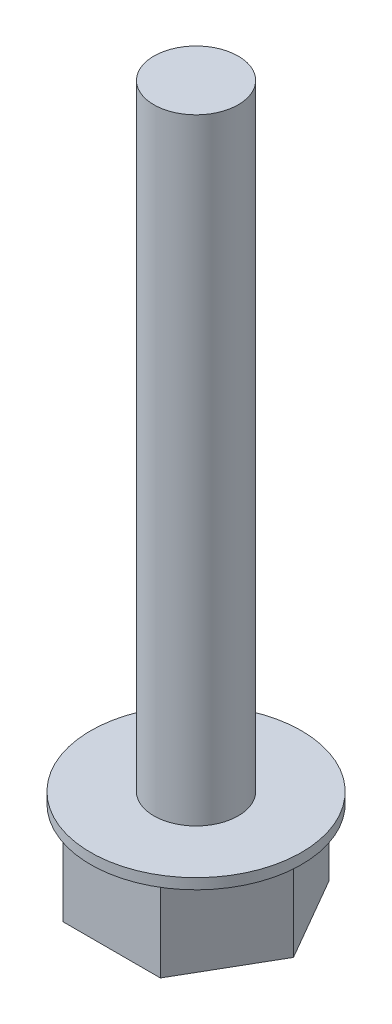
ISO-10303-21;
HEADER;
FILE_DESCRIPTION(('STEP AP214'),'2;1');
FILE_NAME('part.step','',(''),(''),'','','');
FILE_SCHEMA(('AUTOMOTIVE_DESIGN { 1 0 10303 214 1 1 1 1 }'));
ENDSEC;
DATA;
#1=APPLICATION_CONTEXT('core data for automotive mechanical design processes');
#2=APPLICATION_PROTOCOL_DEFINITION('international standard','automotive_design',2000,#1);
#3=PRODUCT_CONTEXT('',#1,'mechanical');
#4=PRODUCT('Part','Part','',(#3));
#5=PRODUCT_RELATED_PRODUCT_CATEGORY('part','',(#4));
#6=PRODUCT_DEFINITION_FORMATION('','',#4);
#7=PRODUCT_DEFINITION_CONTEXT('part definition',#1,'design');
#8=PRODUCT_DEFINITION('design','',#6,#7);
#9=PRODUCT_DEFINITION_SHAPE('','',#8);
#10=(LENGTH_UNIT() NAMED_UNIT(*) SI_UNIT(.MILLI.,.METRE.));
#11=(NAMED_UNIT(*) PLANE_ANGLE_UNIT() SI_UNIT($,.RADIAN.));
#12=(NAMED_UNIT(*) SI_UNIT($,.STERADIAN.) SOLID_ANGLE_UNIT());
#13=UNCERTAINTY_MEASURE_WITH_UNIT(LENGTH_MEASURE(1.E-05),#10,'distance_accuracy_value','');
#14=(GEOMETRIC_REPRESENTATION_CONTEXT(3) GLOBAL_UNCERTAINTY_ASSIGNED_CONTEXT((#13)) GLOBAL_UNIT_ASSIGNED_CONTEXT((#10,
#11,#12)) REPRESENTATION_CONTEXT('',''));
#15=CARTESIAN_POINT('',(0.,0.,0.));
#16=DIRECTION('',(0.,0.,1.));
#17=DIRECTION('',(1.,0.,0.));
#18=AXIS2_PLACEMENT_3D('',#15,#16,#17);
#19=CARTESIAN_POINT('',(0.,46.355,0.));
#20=DIRECTION('',(0.,-1.,0.));
#21=DIRECTION('',(0.,0.,-1.));
#22=AXIS2_PLACEMENT_3D('',#19,#20,#21);
#23=CYLINDRICAL_SURFACE('',#22,3.175);
#24=CARTESIAN_POINT('',(0.,46.355,0.));
#25=DIRECTION('',(0.,1.,0.));
#26=DIRECTION('',(0.,0.,1.));
#27=AXIS2_PLACEMENT_3D('',#24,#25,#26);
#28=CIRCLE('',#27,3.175);
#29=CARTESIAN_POINT('',(0.,46.355,-3.175));
#30=VERTEX_POINT('',#29);
#31=EDGE_CURVE('E11',#30,#30,#28,.T.);
#32=CARTESIAN_POINT('',(0.,0.,0.));
#33=DIRECTION('',(0.,1.,0.));
#34=DIRECTION('',(0.,0.,1.));
#35=AXIS2_PLACEMENT_3D('',#32,#33,#34);
#36=CIRCLE('',#35,3.175);
#37=CARTESIAN_POINT('',(0.,0.,-3.175));
#38=VERTEX_POINT('',#37);
#39=EDGE_CURVE('E36',#38,#38,#36,.T.);
#40=CARTESIAN_POINT('',(0.,46.355,-3.175));
#41=CARTESIAN_POINT('',(0.,45.8721354166667,-3.175));
#42=CARTESIAN_POINT('',(0.,45.3892708333333,-3.175));
#43=CARTESIAN_POINT('',(0.,44.4235416666667,-3.175));
#44=CARTESIAN_POINT('',(0.,43.9406770833333,-3.175));
#45=CARTESIAN_POINT('',(0.,42.9749479166667,-3.175));
#46=CARTESIAN_POINT('',(0.,42.4920833333333,-3.175));
#47=CARTESIAN_POINT('',(0.,41.5263541666667,-3.175));
#48=CARTESIAN_POINT('',(0.,41.0434895833333,-3.175));
#49=CARTESIAN_POINT('',(0.,40.0777604166667,-3.175));
#50=CARTESIAN_POINT('',(0.,39.5948958333333,-3.175));
#51=CARTESIAN_POINT('',(0.,38.6291666666667,-3.175));
#52=CARTESIAN_POINT('',(0.,38.1463020833333,-3.175));
#53=CARTESIAN_POINT('',(0.,37.1805729166667,-3.175));
#54=CARTESIAN_POINT('',(0.,36.6977083333333,-3.175));
#55=CARTESIAN_POINT('',(0.,35.7319791666667,-3.175));
#56=CARTESIAN_POINT('',(0.,35.2491145833333,-3.175));
#57=CARTESIAN_POINT('',(0.,34.2833854166667,-3.175));
#58=CARTESIAN_POINT('',(0.,33.8005208333333,-3.175));
#59=CARTESIAN_POINT('',(0.,32.8347916666667,-3.175));
#60=CARTESIAN_POINT('',(0.,32.3519270833333,-3.175));
#61=CARTESIAN_POINT('',(0.,31.3861979166667,-3.175));
#62=CARTESIAN_POINT('',(0.,30.9033333333333,-3.175));
#63=CARTESIAN_POINT('',(0.,29.9376041666667,-3.175));
#64=CARTESIAN_POINT('',(0.,29.4547395833333,-3.175));
#65=CARTESIAN_POINT('',(0.,28.4890104166667,-3.175));
#66=CARTESIAN_POINT('',(0.,28.0061458333333,-3.175));
#67=CARTESIAN_POINT('',(0.,27.0404166666667,-3.175));
#68=CARTESIAN_POINT('',(0.,26.5575520833333,-3.175));
#69=CARTESIAN_POINT('',(0.,25.5918229166667,-3.175));
#70=CARTESIAN_POINT('',(0.,25.1089583333333,-3.175));
#71=CARTESIAN_POINT('',(0.,24.1432291666667,-3.175));
#72=CARTESIAN_POINT('',(0.,23.6603645833333,-3.175));
#73=CARTESIAN_POINT('',(0.,22.6946354166667,-3.175));
#74=CARTESIAN_POINT('',(0.,22.2117708333333,-3.175));
#75=CARTESIAN_POINT('',(0.,21.2460416666667,-3.175));
#76=CARTESIAN_POINT('',(0.,20.7631770833333,-3.175));
#77=CARTESIAN_POINT('',(0.,19.7974479166667,-3.175));
#78=CARTESIAN_POINT('',(0.,19.3145833333333,-3.175));
#79=CARTESIAN_POINT('',(0.,18.3488541666667,-3.175));
#80=CARTESIAN_POINT('',(0.,17.8659895833333,-3.175));
#81=CARTESIAN_POINT('',(0.,16.9002604166667,-3.175));
#82=CARTESIAN_POINT('',(0.,16.4173958333333,-3.175));
#83=CARTESIAN_POINT('',(0.,15.4516666666667,-3.175));
#84=CARTESIAN_POINT('',(0.,14.9688020833333,-3.175));
#85=CARTESIAN_POINT('',(0.,14.0030729166667,-3.175));
#86=CARTESIAN_POINT('',(0.,13.5202083333333,-3.175));
#87=CARTESIAN_POINT('',(0.,12.5544791666667,-3.175));
#88=CARTESIAN_POINT('',(0.,12.0716145833333,-3.175));
#89=CARTESIAN_POINT('',(0.,11.1058854166667,-3.175));
#90=CARTESIAN_POINT('',(0.,10.6230208333333,-3.175));
#91=CARTESIAN_POINT('',(0.,9.65729166666667,-3.175));
#92=CARTESIAN_POINT('',(0.,9.17442708333333,-3.175));
#93=CARTESIAN_POINT('',(0.,8.20869791666667,-3.175));
#94=CARTESIAN_POINT('',(0.,7.72583333333333,-3.175));
#95=CARTESIAN_POINT('',(0.,6.76010416666667,-3.175));
#96=CARTESIAN_POINT('',(0.,6.27723958333334,-3.175));
#97=CARTESIAN_POINT('',(0.,5.31151041666667,-3.175));
#98=CARTESIAN_POINT('',(0.,4.82864583333333,-3.175));
#99=CARTESIAN_POINT('',(0.,3.86291666666667,-3.175));
#100=CARTESIAN_POINT('',(0.,3.38005208333333,-3.175));
#101=CARTESIAN_POINT('',(0.,2.41432291666667,-3.175));
#102=CARTESIAN_POINT('',(0.,1.93145833333333,-3.175));
#103=CARTESIAN_POINT('',(0.,0.965729166666665,-3.175));
#104=CARTESIAN_POINT('',(0.,0.482864583333333,-3.175));
#105=CARTESIAN_POINT('',(0.,0.,-3.175));
#106=B_SPLINE_CURVE_WITH_KNOTS('',3,(#40,#41,#42,#43,#44,#45,#46,#47,#48,#49,#50,#51,#52,#53,
#54,#55,#56,#57,#58,#59,#60,#61,#62,#63,#64,#65,#66,#67,#68,#69,#70,#71,#72,#73,#74,#75,#76,#77,
#78,#79,#80,#81,#82,#83,#84,#85,#86,#87,#88,#89,#90,#91,#92,#93,#94,#95,#96,#97,#98,#99,#100,
#101,#102,#103,#104,#105),.UNSPECIFIED.,.F.,.F.,(4,2,2,2,2,2,2,2,2,2,2,2,2,2,2,2,2,2,2,2,2,2,2,
2,2,2,2,2,2,2,2,2,4),(0.,1.44859375,2.8971875,4.34578125000001,5.794375,7.24296875,
8.69156250000001,10.14015625,11.58875,13.03734375,14.4859375,15.93453125,17.383125,18.83171875,
20.2803125,21.72890625,23.1775,24.62609375,26.0746875,27.52328125,28.971875,30.42046875,
31.8690625,33.31765625,34.76625,36.21484375,37.6634375,39.11203125,40.560625,42.00921875,
43.4578125,44.90640625,46.355),.UNSPECIFIED.);
#107=EDGE_CURVE('BSEAM33',#30,#38,#106,.T.);
#108=ORIENTED_EDGE('',*,*,#31,.F.);
#109=ORIENTED_EDGE('',*,*,#39,.T.);
#110=ORIENTED_EDGE('',*,*,#107,.T.);
#111=ORIENTED_EDGE('',*,*,#107,.F.);
#112=EDGE_LOOP('',(#108,#110,#109,#111));
#113=FACE_BOUND('',#112,.T.);
#114=ADVANCED_FACE('F33',(#113),#23,.T.);
#115=CARTESIAN_POINT('',(0.,46.355,0.));
#116=DIRECTION('',(0.,1.,0.));
#117=DIRECTION('',(0.,0.,1.));
#118=AXIS2_PLACEMENT_3D('',#115,#116,#117);
#119=PLANE('',#118);
#120=ORIENTED_EDGE('',*,*,#31,.T.);
#121=EDGE_LOOP('',(#120));
#122=FACE_BOUND('',#121,.T.);
#123=ADVANCED_FACE('F168',(#122),#119,.T.);
#124=CARTESIAN_POINT('',(0.,-0.79375,0.));
#125=DIRECTION('',(0.,1.,0.));
#126=DIRECTION('',(0.,0.,1.));
#127=AXIS2_PLACEMENT_3D('',#124,#125,#126);
#128=CYLINDRICAL_SURFACE('',#127,7.9375);
#129=CARTESIAN_POINT('',(0.,-0.79375,0.));
#130=DIRECTION('',(0.,-1.,0.));
#131=DIRECTION('',(0.,0.,-1.));
#132=AXIS2_PLACEMENT_3D('',#129,#130,#131);
#133=CIRCLE('',#132,7.9375);
#134=CARTESIAN_POINT('',(0.,-0.79375,-7.9375));
#135=VERTEX_POINT('',#134);
#136=EDGE_CURVE('E143',#135,#135,#133,.T.);
#137=ORIENTED_EDGE('',*,*,#136,.F.);
#138=EDGE_LOOP('',(#137));
#139=FACE_BOUND('',#138,.T.);
#140=CARTESIAN_POINT('',(0.,0.,0.));
#141=DIRECTION('',(0.,-1.,0.));
#142=DIRECTION('',(0.,0.,-1.));
#143=AXIS2_PLACEMENT_3D('',#140,#141,#142);
#144=CIRCLE('',#143,7.9375);
#145=CARTESIAN_POINT('',(0.,0.,-7.9375));
#146=VERTEX_POINT('',#145);
#147=EDGE_CURVE('E142',#146,#146,#144,.T.);
#148=ORIENTED_EDGE('',*,*,#147,.T.);
#149=EDGE_LOOP('',(#148));
#150=FACE_BOUND('',#149,.T.);
#151=ADVANCED_FACE('F149',(#139,#150),#128,.T.);
#152=CARTESIAN_POINT('',(0.,-0.79375,0.));
#153=DIRECTION('',(0.,-1.,0.));
#154=DIRECTION('',(0.,0.,-1.));
#155=AXIS2_PLACEMENT_3D('',#152,#153,#154);
#156=PLANE('',#155);
#157=DIRECTION('',(-0.5,0.,0.866025403784438));
#158=VECTOR('',#157,1.);
#159=CARTESIAN_POINT('',(7.33234841870825,-0.79375,0.));
#160=LINE('',#159,#158);
#161=CARTESIAN_POINT('',(7.33234841870825,-0.79375,0.));
#162=VERTEX_POINT('',#161);
#163=CARTESIAN_POINT('',(3.66617420935412,-0.79375,6.35));
#164=VERTEX_POINT('',#163);
#165=EDGE_CURVE('E47',#162,#164,#160,.T.);
#166=ORIENTED_EDGE('',*,*,#165,.F.);
#167=DIRECTION('',(0.5,0.,0.866025403784439));
#168=VECTOR('',#167,1.);
#169=CARTESIAN_POINT('',(3.66617420935413,-0.79375,-6.35));
#170=LINE('',#169,#168);
#171=CARTESIAN_POINT('',(3.66617420935413,-0.79375,-6.35));
#172=VERTEX_POINT('',#171);
#173=EDGE_CURVE('E51',#172,#162,#170,.T.);
#174=ORIENTED_EDGE('',*,*,#173,.F.);
#175=DIRECTION('',(1.,0.,0.));
#176=VECTOR('',#175,1.);
#177=CARTESIAN_POINT('',(-3.66617420935412,-0.79375,-6.35));
#178=LINE('',#177,#176);
#179=CARTESIAN_POINT('',(-3.66617420935412,-0.79375,-6.35));
#180=VERTEX_POINT('',#179);
#181=EDGE_CURVE('E122',#180,#172,#178,.T.);
#182=ORIENTED_EDGE('',*,*,#181,.F.);
#183=DIRECTION('',(0.5,0.,-0.866025403784439));
#184=VECTOR('',#183,1.);
#185=CARTESIAN_POINT('',(-7.33234841870825,-0.79375,0.));
#186=LINE('',#185,#184);
#187=CARTESIAN_POINT('',(-7.33234841870825,-0.79375,0.));
#188=VERTEX_POINT('',#187);
#189=EDGE_CURVE('E119',#188,#180,#186,.T.);
#190=ORIENTED_EDGE('',*,*,#189,.F.);
#191=DIRECTION('',(-0.5,0.,-0.866025403784438));
#192=VECTOR('',#191,1.);
#193=CARTESIAN_POINT('',(-3.66617420935412,-0.79375,6.35));
#194=LINE('',#193,#192);
#195=CARTESIAN_POINT('',(-3.66617420935412,-0.79375,6.35));
#196=VERTEX_POINT('',#195);
#197=EDGE_CURVE('E116',#196,#188,#194,.T.);
#198=ORIENTED_EDGE('',*,*,#197,.F.);
#199=DIRECTION('',(-1.,0.,0.));
#200=VECTOR('',#199,1.);
#201=CARTESIAN_POINT('',(3.66617420935412,-0.79375,6.35));
#202=LINE('',#201,#200);
#203=EDGE_CURVE('E113',#164,#196,#202,.T.);
#204=ORIENTED_EDGE('',*,*,#203,.F.);
#205=EDGE_LOOP('',(#166,#174,#182,#190,#198,#204));
#206=FACE_BOUND('',#205,.T.);
#207=ORIENTED_EDGE('',*,*,#136,.T.);
#208=EDGE_LOOP('',(#207));
#209=FACE_BOUND('',#208,.T.);
#210=ADVANCED_FACE('F154',(#206,#209),#156,.T.);
#211=CARTESIAN_POINT('',(0.,0.,0.));
#212=DIRECTION('',(0.,-1.,0.));
#213=DIRECTION('',(0.,0.,-1.));
#214=AXIS2_PLACEMENT_3D('',#211,#212,#213);
#215=PLANE('',#214);
#216=ORIENTED_EDGE('',*,*,#39,.F.);
#217=EDGE_LOOP('',(#216));
#218=FACE_BOUND('',#217,.T.);
#219=ORIENTED_EDGE('',*,*,#147,.F.);
#220=EDGE_LOOP('',(#219));
#221=FACE_BOUND('',#220,.T.);
#222=ADVANCED_FACE('F151',(#218,#221),#215,.F.);
#223=CARTESIAN_POINT('',(7.33234841870825,-7.14375,0.));
#224=DIRECTION('',(-0.866025403784438,0.,-0.5));
#225=DIRECTION('',(-0.5,0.,0.866025403784438));
#226=AXIS2_PLACEMENT_3D('',#223,#224,#225);
#227=PLANE('',#226);
#228=ORIENTED_EDGE('',*,*,#165,.T.);
#229=DIRECTION('',(0.,1.,0.));
#230=VECTOR('',#229,1.);
#231=CARTESIAN_POINT('',(3.66617420935412,-7.14375,6.35));
#232=LINE('',#231,#230);
#233=CARTESIAN_POINT('',(3.66617420935412,-7.14375,6.35));
#234=VERTEX_POINT('',#233);
#235=EDGE_CURVE('E139',#234,#164,#232,.T.);
#236=ORIENTED_EDGE('',*,*,#235,.F.);
#237=DIRECTION('',(-0.5,0.,0.866025403784438));
#238=VECTOR('',#237,1.);
#239=CARTESIAN_POINT('',(7.33234841870825,-7.14375,0.));
#240=LINE('',#239,#238);
#241=CARTESIAN_POINT('',(7.33234841870825,-7.14375,0.));
#242=VERTEX_POINT('',#241);
#243=EDGE_CURVE('E98',#242,#234,#240,.T.);
#244=ORIENTED_EDGE('',*,*,#243,.F.);
#245=DIRECTION('',(0.,1.,0.));
#246=VECTOR('',#245,1.);
#247=CARTESIAN_POINT('',(7.33234841870825,-7.14375,0.));
#248=LINE('',#247,#246);
#249=EDGE_CURVE('E111',#242,#162,#248,.T.);
#250=ORIENTED_EDGE('',*,*,#249,.T.);
#251=EDGE_LOOP('',(#228,#236,#244,#250));
#252=FACE_BOUND('',#251,.T.);
#253=ADVANCED_FACE('F153',(#252),#227,.F.);
#254=CARTESIAN_POINT('',(3.66617420935412,-7.14375,6.35));
#255=DIRECTION('',(0.,0.,-1.));
#256=DIRECTION('',(-1.,0.,0.));
#257=AXIS2_PLACEMENT_3D('',#254,#255,#256);
#258=PLANE('',#257);
#259=ORIENTED_EDGE('',*,*,#203,.T.);
#260=DIRECTION('',(0.,1.,0.));
#261=VECTOR('',#260,1.);
#262=CARTESIAN_POINT('',(-3.66617420935412,-7.14375,6.35));
#263=LINE('',#262,#261);
#264=CARTESIAN_POINT('',(-3.66617420935412,-7.14375,6.35));
#265=VERTEX_POINT('',#264);
#266=EDGE_CURVE('E136',#265,#196,#263,.T.);
#267=ORIENTED_EDGE('',*,*,#266,.F.);
#268=DIRECTION('',(-1.,0.,0.));
#269=VECTOR('',#268,1.);
#270=CARTESIAN_POINT('',(3.66617420935412,-7.14375,6.35));
#271=LINE('',#270,#269);
#272=EDGE_CURVE('E101',#234,#265,#271,.T.);
#273=ORIENTED_EDGE('',*,*,#272,.F.);
#274=ORIENTED_EDGE('',*,*,#235,.T.);
#275=EDGE_LOOP('',(#259,#267,#273,#274));
#276=FACE_BOUND('',#275,.T.);
#277=ADVANCED_FACE('F161',(#276),#258,.F.);
#278=CARTESIAN_POINT('',(-3.66617420935412,-7.14375,6.35));
#279=DIRECTION('',(0.866025403784439,0.,-0.5));
#280=DIRECTION('',(-0.5,0.,-0.866025403784439));
#281=AXIS2_PLACEMENT_3D('',#278,#279,#280);
#282=PLANE('',#281);
#283=ORIENTED_EDGE('',*,*,#197,.T.);
#284=DIRECTION('',(0.,1.,0.));
#285=VECTOR('',#284,1.);
#286=CARTESIAN_POINT('',(-7.33234841870825,-7.14375,0.));
#287=LINE('',#286,#285);
#288=CARTESIAN_POINT('',(-7.33234841870825,-7.14375,0.));
#289=VERTEX_POINT('',#288);
#290=EDGE_CURVE('E133',#289,#188,#287,.T.);
#291=ORIENTED_EDGE('',*,*,#290,.F.);
#292=DIRECTION('',(-0.5,0.,-0.866025403784438));
#293=VECTOR('',#292,1.);
#294=CARTESIAN_POINT('',(-3.66617420935412,-7.14375,6.35));
#295=LINE('',#294,#293);
#296=EDGE_CURVE('E103',#265,#289,#295,.T.);
#297=ORIENTED_EDGE('',*,*,#296,.F.);
#298=ORIENTED_EDGE('',*,*,#266,.T.);
#299=EDGE_LOOP('',(#283,#291,#297,#298));
#300=FACE_BOUND('',#299,.T.);
#301=ADVANCED_FACE('F206',(#300),#282,.F.);
#302=CARTESIAN_POINT('',(-7.33234841870825,-7.14375,0.));
#303=DIRECTION('',(0.866025403784439,0.,0.5));
#304=DIRECTION('',(0.5,0.,-0.866025403784439));
#305=AXIS2_PLACEMENT_3D('',#302,#303,#304);
#306=PLANE('',#305);
#307=ORIENTED_EDGE('',*,*,#189,.T.);
#308=DIRECTION('',(0.,1.,0.));
#309=VECTOR('',#308,1.);
#310=CARTESIAN_POINT('',(-3.66617420935412,-7.14375,-6.35));
#311=LINE('',#310,#309);
#312=CARTESIAN_POINT('',(-3.66617420935412,-7.14375,-6.35));
#313=VERTEX_POINT('',#312);
#314=EDGE_CURVE('E130',#313,#180,#311,.T.);
#315=ORIENTED_EDGE('',*,*,#314,.F.);
#316=DIRECTION('',(0.5,0.,-0.866025403784439));
#317=VECTOR('',#316,1.);
#318=CARTESIAN_POINT('',(-7.33234841870825,-7.14375,0.));
#319=LINE('',#318,#317);
#320=EDGE_CURVE('E105',#289,#313,#319,.T.);
#321=ORIENTED_EDGE('',*,*,#320,.F.);
#322=ORIENTED_EDGE('',*,*,#290,.T.);
#323=EDGE_LOOP('',(#307,#315,#321,#322));
#324=FACE_BOUND('',#323,.T.);
#325=ADVANCED_FACE('F216',(#324),#306,.F.);
#326=CARTESIAN_POINT('',(-3.66617420935412,-7.14375,-6.35));
#327=DIRECTION('',(0.,0.,1.));
#328=DIRECTION('',(1.,0.,0.));
#329=AXIS2_PLACEMENT_3D('',#326,#327,#328);
#330=PLANE('',#329);
#331=ORIENTED_EDGE('',*,*,#181,.T.);
#332=DIRECTION('',(0.,1.,0.));
#333=VECTOR('',#332,1.);
#334=CARTESIAN_POINT('',(3.66617420935413,-7.14375,-6.35));
#335=LINE('',#334,#333);
#336=CARTESIAN_POINT('',(3.66617420935413,-7.14375,-6.35));
#337=VERTEX_POINT('',#336);
#338=EDGE_CURVE('E127',#337,#172,#335,.T.);
#339=ORIENTED_EDGE('',*,*,#338,.F.);
#340=DIRECTION('',(1.,0.,0.));
#341=VECTOR('',#340,1.);
#342=CARTESIAN_POINT('',(-3.66617420935412,-7.14375,-6.35));
#343=LINE('',#342,#341);
#344=EDGE_CURVE('E107',#313,#337,#343,.T.);
#345=ORIENTED_EDGE('',*,*,#344,.F.);
#346=ORIENTED_EDGE('',*,*,#314,.T.);
#347=EDGE_LOOP('',(#331,#339,#345,#346));
#348=FACE_BOUND('',#347,.T.);
#349=ADVANCED_FACE('F226',(#348),#330,.F.);
#350=CARTESIAN_POINT('',(3.66617420935413,-7.14375,-6.35));
#351=DIRECTION('',(-0.866025403784439,0.,0.5));
#352=DIRECTION('',(0.5,0.,0.866025403784439));
#353=AXIS2_PLACEMENT_3D('',#350,#351,#352);
#354=PLANE('',#353);
#355=ORIENTED_EDGE('',*,*,#173,.T.);
#356=ORIENTED_EDGE('',*,*,#249,.F.);
#357=DIRECTION('',(0.5,0.,0.866025403784439));
#358=VECTOR('',#357,1.);
#359=CARTESIAN_POINT('',(3.66617420935413,-7.14375,-6.35));
#360=LINE('',#359,#358);
#361=EDGE_CURVE('E109',#337,#242,#360,.T.);
#362=ORIENTED_EDGE('',*,*,#361,.F.);
#363=ORIENTED_EDGE('',*,*,#338,.T.);
#364=EDGE_LOOP('',(#355,#356,#362,#363));
#365=FACE_BOUND('',#364,.T.);
#366=ADVANCED_FACE('F236',(#365),#354,.F.);
#367=CARTESIAN_POINT('',(0.,-7.14375,0.));
#368=DIRECTION('',(0.,-1.,0.));
#369=DIRECTION('',(0.,0.,-1.));
#370=AXIS2_PLACEMENT_3D('',#367,#368,#369);
#371=PLANE('',#370);
#372=CARTESIAN_POINT('',(0.,-7.14375,0.));
#373=DIRECTION('',(0.,-1.,0.));
#374=DIRECTION('',(0.,0.,-1.));
#375=AXIS2_PLACEMENT_3D('',#372,#373,#374);
#376=CIRCLE('',#375,1.63195);
#377=CARTESIAN_POINT('',(0.,-7.14375,-1.63195));
#378=VERTEX_POINT('',#377);
#379=EDGE_CURVE('E93',#378,#378,#376,.T.);
#380=ORIENTED_EDGE('',*,*,#379,.F.);
#381=EDGE_LOOP('',(#380));
#382=FACE_BOUND('',#381,.T.);
#383=ORIENTED_EDGE('',*,*,#243,.T.);
#384=ORIENTED_EDGE('',*,*,#272,.T.);
#385=ORIENTED_EDGE('',*,*,#296,.T.);
#386=ORIENTED_EDGE('',*,*,#320,.T.);
#387=ORIENTED_EDGE('',*,*,#344,.T.);
#388=ORIENTED_EDGE('',*,*,#361,.T.);
#389=EDGE_LOOP('',(#383,#384,#385,#386,#387,#388));
#390=FACE_BOUND('',#389,.T.);
#391=ADVANCED_FACE('F246',(#382,#390),#371,.T.);
#392=CARTESIAN_POINT('',(0.,-7.14375,0.));
#393=DIRECTION('',(0.,-1.,0.));
#394=DIRECTION('',(0.,0.,-1.));
#395=AXIS2_PLACEMENT_3D('',#392,#393,#394);
#396=CYLINDRICAL_SURFACE('',#395,1.63195);
#397=CARTESIAN_POINT('',(0.,3.96874999999999,0.));
#398=DIRECTION('',(0.,-1.,0.));
#399=DIRECTION('',(0.,0.,-1.));
#400=AXIS2_PLACEMENT_3D('',#397,#398,#399);
#401=CIRCLE('',#400,1.63195);
#402=CARTESIAN_POINT('',(0.,3.96874999999999,-1.63195));
#403=VERTEX_POINT('',#402);
#404=EDGE_CURVE('E91',#403,#403,#401,.T.);
#405=ORIENTED_EDGE('',*,*,#404,.F.);
#406=EDGE_LOOP('',(#405));
#407=FACE_BOUND('',#406,.T.);
#408=ORIENTED_EDGE('',*,*,#379,.T.);
#409=EDGE_LOOP('',(#408));
#410=FACE_BOUND('',#409,.T.);
#411=ADVANCED_FACE('F87',(#407,#410),#396,.F.);
#412=CARTESIAN_POINT('',(0.,3.96874999999999,0.));
#413=DIRECTION('',(0.,-1.,0.));
#414=DIRECTION('',(0.,0.,-1.));
#415=AXIS2_PLACEMENT_3D('',#412,#413,#414);
#416=CONICAL_SURFACE('',#415,1.63195,1.02974425867666);
#417=CARTESIAN_POINT('',(0.,4.94932448722202,0.));
#418=VERTEX_POINT('',#417);
#419=VERTEX_LOOP('',#418);
#420=FACE_BOUND('',#419,.T.);
#421=ORIENTED_EDGE('',*,*,#404,.T.);
#422=EDGE_LOOP('',(#421));
#423=FACE_BOUND('',#422,.T.);
#424=ADVANCED_FACE('F84',(#420,#423),#416,.F.);
#425=CLOSED_SHELL('',(#114,#123,#151,#210,#222,#253,#277,#301,#325,#349,#366,#391,#411,#424));
#426=MANIFOLD_SOLID_BREP('B2',#425);
#427=ADVANCED_BREP_SHAPE_REPRESENTATION('',(#18,#426),#14);
#428=SHAPE_DEFINITION_REPRESENTATION(#9,#427);
ENDSEC;
END-ISO-10303-21;
